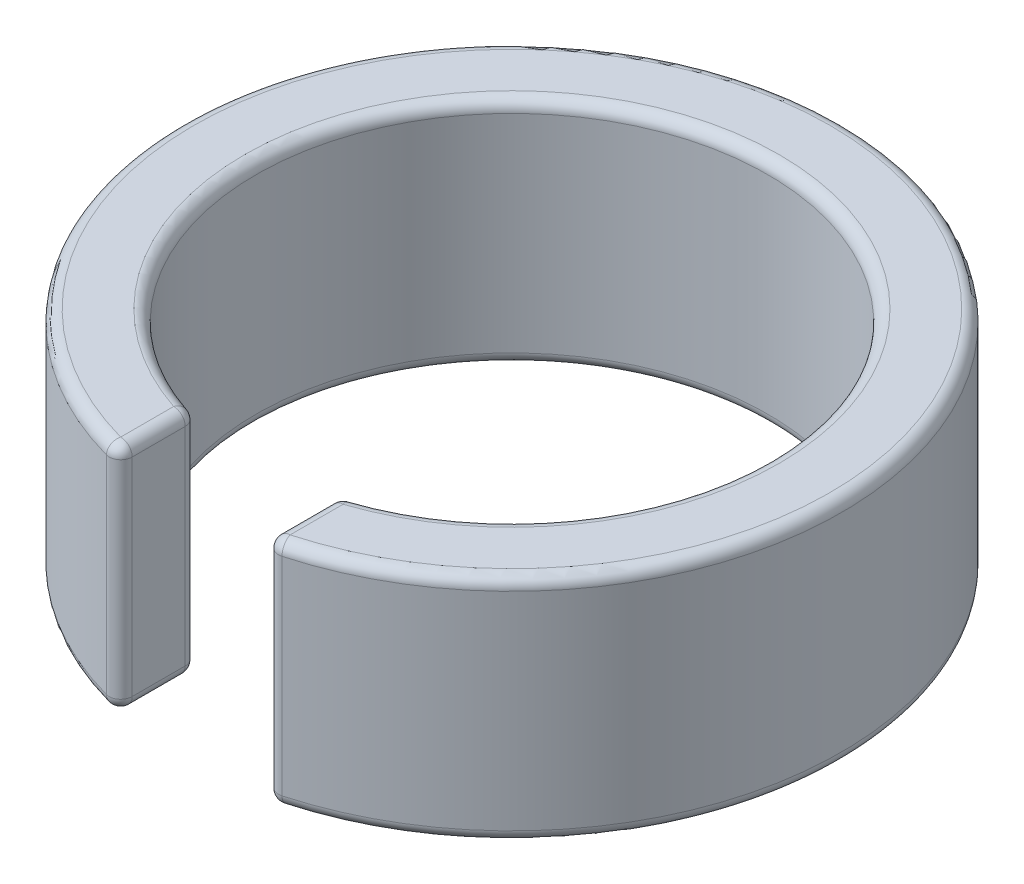
ISO-10303-21;
HEADER;
FILE_DESCRIPTION(('STEP AP214'),'2;1');
FILE_NAME('part.step','',(''),(''),'','','');
FILE_SCHEMA(('AUTOMOTIVE_DESIGN { 1 0 10303 214 1 1 1 1 }'));
ENDSEC;
DATA;
#1=APPLICATION_CONTEXT('core data for automotive mechanical design processes');
#2=APPLICATION_PROTOCOL_DEFINITION('international standard','automotive_design',2000,#1);
#3=PRODUCT_CONTEXT('',#1,'mechanical');
#4=PRODUCT('Part','Part','',(#3));
#5=PRODUCT_RELATED_PRODUCT_CATEGORY('part','',(#4));
#6=PRODUCT_DEFINITION_FORMATION('','',#4);
#7=PRODUCT_DEFINITION_CONTEXT('part definition',#1,'design');
#8=PRODUCT_DEFINITION('design','',#6,#7);
#9=PRODUCT_DEFINITION_SHAPE('','',#8);
#10=(LENGTH_UNIT() NAMED_UNIT(*) SI_UNIT(.MILLI.,.METRE.));
#11=(NAMED_UNIT(*) PLANE_ANGLE_UNIT() SI_UNIT($,.RADIAN.));
#12=(NAMED_UNIT(*) SI_UNIT($,.STERADIAN.) SOLID_ANGLE_UNIT());
#13=UNCERTAINTY_MEASURE_WITH_UNIT(LENGTH_MEASURE(1.E-05),#10,'distance_accuracy_value','');
#14=(GEOMETRIC_REPRESENTATION_CONTEXT(3) GLOBAL_UNCERTAINTY_ASSIGNED_CONTEXT((#13)) GLOBAL_UNIT_ASSIGNED_CONTEXT((#10,
#11,#12)) REPRESENTATION_CONTEXT('',''));
#15=CARTESIAN_POINT('',(0.,0.,0.));
#16=DIRECTION('',(0.,0.,1.));
#17=DIRECTION('',(1.,0.,0.));
#18=AXIS2_PLACEMENT_3D('',#15,#16,#17);
#19=CARTESIAN_POINT('',(0.,10.,0.));
#20=DIRECTION('',(0.,1.,0.));
#21=DIRECTION('',(0.,0.,1.));
#22=AXIS2_PLACEMENT_3D('',#19,#20,#21);
#23=PLANE('',#22);
#24=CARTESIAN_POINT('',(0.,10.,0.));
#25=DIRECTION('',(0.,1.,0.));
#26=DIRECTION('',(0.,0.,1.));
#27=AXIS2_PLACEMENT_3D('',#24,#25,#26);
#28=CIRCLE('',#27,11.6);
#29=CARTESIAN_POINT('',(-3.675,10.,11.0024713133005));
#30=VERTEX_POINT('',#29);
#31=CARTESIAN_POINT('',(3.675,10.,11.0024713133005));
#32=VERTEX_POINT('',#31);
#33=EDGE_CURVE('E48',#30,#32,#28,.F.);
#34=ORIENTED_EDGE('',*,*,#33,.T.);
#35=DIRECTION('',(0.,0.,-1.));
#36=VECTOR('',#35,1.);
#37=CARTESIAN_POINT('',(3.675,10.,0.));
#38=LINE('',#37,#36);
#39=CARTESIAN_POINT('',(3.675,10.,13.3016681284717));
#40=VERTEX_POINT('',#39);
#41=EDGE_CURVE('E11',#32,#40,#38,.F.);
#42=ORIENTED_EDGE('',*,*,#41,.T.);
#43=CARTESIAN_POINT('',(0.,10.,0.));
#44=DIRECTION('',(0.,1.,0.));
#45=DIRECTION('',(0.,0.,1.));
#46=AXIS2_PLACEMENT_3D('',#43,#44,#45);
#47=CIRCLE('',#46,13.8);
#48=CARTESIAN_POINT('',(-3.675,10.,13.3016681284717));
#49=VERTEX_POINT('',#48);
#50=EDGE_CURVE('E200',#40,#49,#47,.T.);
#51=ORIENTED_EDGE('',*,*,#50,.T.);
#52=DIRECTION('',(0.,0.,1.));
#53=VECTOR('',#52,1.);
#54=CARTESIAN_POINT('',(-3.675,10.,0.));
#55=LINE('',#54,#53);
#56=EDGE_CURVE('E59',#49,#30,#55,.F.);
#57=ORIENTED_EDGE('',*,*,#56,.T.);
#58=EDGE_LOOP('',(#34,#42,#51,#57));
#59=FACE_BOUND('',#58,.T.);
#60=ADVANCED_FACE('F39',(#59),#23,.T.);
#61=CARTESIAN_POINT('',(0.,0.,0.));
#62=DIRECTION('',(0.,1.,0.));
#63=DIRECTION('',(0.,0.,1.));
#64=AXIS2_PLACEMENT_3D('',#61,#62,#63);
#65=PLANE('',#64);
#66=DIRECTION('',(0.,0.,-1.));
#67=VECTOR('',#66,1.);
#68=CARTESIAN_POINT('',(3.675,0.,10.6362293600693));
#69=LINE('',#68,#67);
#70=CARTESIAN_POINT('',(3.675,0.,13.3016681284717));
#71=VERTEX_POINT('',#70);
#72=CARTESIAN_POINT('',(3.675,0.,11.0024713133005));
#73=VERTEX_POINT('',#72);
#74=EDGE_CURVE('E195',#71,#73,#69,.T.);
#75=ORIENTED_EDGE('',*,*,#74,.T.);
#76=CARTESIAN_POINT('',(0.,0.,0.));
#77=DIRECTION('',(0.,1.,0.));
#78=DIRECTION('',(0.,0.,1.));
#79=AXIS2_PLACEMENT_3D('',#76,#77,#78);
#80=CIRCLE('',#79,11.6);
#81=CARTESIAN_POINT('',(-3.675,0.,11.0024713133005));
#82=VERTEX_POINT('',#81);
#83=EDGE_CURVE('E197',#73,#82,#80,.T.);
#84=ORIENTED_EDGE('',*,*,#83,.T.);
#85=DIRECTION('',(0.,0.,1.));
#86=VECTOR('',#85,1.);
#87=CARTESIAN_POINT('',(-3.675,0.,13.9430762387645));
#88=LINE('',#87,#86);
#89=CARTESIAN_POINT('',(-3.675,0.,13.3016681284717));
#90=VERTEX_POINT('',#89);
#91=EDGE_CURVE('E191',#82,#90,#88,.T.);
#92=ORIENTED_EDGE('',*,*,#91,.T.);
#93=CARTESIAN_POINT('',(0.,0.,0.));
#94=DIRECTION('',(0.,1.,0.));
#95=DIRECTION('',(0.,0.,1.));
#96=AXIS2_PLACEMENT_3D('',#93,#94,#95);
#97=CIRCLE('',#96,13.8);
#98=EDGE_CURVE('E193',#90,#71,#97,.F.);
#99=ORIENTED_EDGE('',*,*,#98,.T.);
#100=EDGE_LOOP('',(#75,#84,#92,#99));
#101=FACE_BOUND('',#100,.T.);
#102=ADVANCED_FACE('F275',(#101),#65,.F.);
#103=CARTESIAN_POINT('',(0.,10.,0.));
#104=DIRECTION('',(0.,-1.,0.));
#105=DIRECTION('',(0.,0.,-1.));
#106=AXIS2_PLACEMENT_3D('',#103,#104,#105);
#107=CYLINDRICAL_SURFACE('',#106,14.3);
#108=DIRECTION('',(0.,-1.,0.));
#109=VECTOR('',#108,1.);
#110=CARTESIAN_POINT('',(3.80815217391304,10.,13.7836126258801));
#111=LINE('',#110,#109);
#112=CARTESIAN_POINT('',(3.80815217391304,9.5,13.7836126258801));
#113=VERTEX_POINT('',#112);
#114=CARTESIAN_POINT('',(3.80815217391304,0.5,13.7836126258801));
#115=VERTEX_POINT('',#114);
#116=EDGE_CURVE('E177',#113,#115,#111,.T.);
#117=ORIENTED_EDGE('',*,*,#116,.T.);
#118=CARTESIAN_POINT('',(0.,0.5,0.));
#119=DIRECTION('',(0.,1.,0.));
#120=DIRECTION('',(0.,0.,1.));
#121=AXIS2_PLACEMENT_3D('',#118,#119,#120);
#122=CIRCLE('',#121,14.3);
#123=CARTESIAN_POINT('',(-3.80815217391304,0.5,13.7836126258801));
#124=VERTEX_POINT('',#123);
#125=EDGE_CURVE('E180',#115,#124,#122,.T.);
#126=ORIENTED_EDGE('',*,*,#125,.T.);
#127=DIRECTION('',(0.,-1.,0.));
#128=VECTOR('',#127,1.);
#129=CARTESIAN_POINT('',(-3.80815217391304,10.,13.7836126258801));
#130=LINE('',#129,#128);
#131=CARTESIAN_POINT('',(-3.80815217391304,9.5,13.7836126258801));
#132=VERTEX_POINT('',#131);
#133=EDGE_CURVE('E175',#124,#132,#130,.F.);
#134=ORIENTED_EDGE('',*,*,#133,.T.);
#135=CARTESIAN_POINT('',(0.,9.5,0.));
#136=DIRECTION('',(0.,1.,0.));
#137=DIRECTION('',(0.,0.,1.));
#138=AXIS2_PLACEMENT_3D('',#135,#136,#137);
#139=CIRCLE('',#138,14.3);
#140=EDGE_CURVE('E173',#132,#113,#139,.F.);
#141=ORIENTED_EDGE('',*,*,#140,.T.);
#142=EDGE_LOOP('',(#117,#126,#134,#141));
#143=FACE_BOUND('',#142,.T.);
#144=ADVANCED_FACE('F302',(#143),#107,.T.);
#145=CARTESIAN_POINT('',(0.,10.,0.));
#146=DIRECTION('',(0.,-1.,0.));
#147=DIRECTION('',(0.,0.,-1.));
#148=AXIS2_PLACEMENT_3D('',#145,#146,#147);
#149=CYLINDRICAL_SURFACE('',#148,11.1);
#150=DIRECTION('',(0.,-1.,0.));
#151=VECTOR('',#150,1.);
#152=CARTESIAN_POINT('',(-3.51659482758621,10.,10.528226860141));
#153=LINE('',#152,#151);
#154=CARTESIAN_POINT('',(-3.51659482758621,9.5,10.528226860141));
#155=VERTEX_POINT('',#154);
#156=CARTESIAN_POINT('',(-3.51659482758621,0.5,10.528226860141));
#157=VERTEX_POINT('',#156);
#158=EDGE_CURVE('E156',#155,#157,#153,.T.);
#159=ORIENTED_EDGE('',*,*,#158,.T.);
#160=CARTESIAN_POINT('',(0.,0.5,0.));
#161=DIRECTION('',(0.,1.,0.));
#162=DIRECTION('',(0.,0.,1.));
#163=AXIS2_PLACEMENT_3D('',#160,#161,#162);
#164=CIRCLE('',#163,11.1);
#165=CARTESIAN_POINT('',(3.51659482758621,0.5,10.528226860141));
#166=VERTEX_POINT('',#165);
#167=EDGE_CURVE('E160',#157,#166,#164,.F.);
#168=ORIENTED_EDGE('',*,*,#167,.T.);
#169=DIRECTION('',(0.,-1.,0.));
#170=VECTOR('',#169,1.);
#171=CARTESIAN_POINT('',(3.51659482758621,10.,10.528226860141));
#172=LINE('',#171,#170);
#173=CARTESIAN_POINT('',(3.51659482758621,9.5,10.528226860141));
#174=VERTEX_POINT('',#173);
#175=EDGE_CURVE('E133',#166,#174,#172,.F.);
#176=ORIENTED_EDGE('',*,*,#175,.T.);
#177=CARTESIAN_POINT('',(0.,9.5,0.));
#178=DIRECTION('',(0.,1.,0.));
#179=DIRECTION('',(0.,0.,1.));
#180=AXIS2_PLACEMENT_3D('',#177,#178,#179);
#181=CIRCLE('',#180,11.1);
#182=EDGE_CURVE('E150',#174,#155,#181,.T.);
#183=ORIENTED_EDGE('',*,*,#182,.T.);
#184=EDGE_LOOP('',(#159,#168,#176,#183));
#185=FACE_BOUND('',#184,.T.);
#186=ADVANCED_FACE('F158',(#185),#149,.F.);
#187=CARTESIAN_POINT('',(3.175,10.,0.));
#188=DIRECTION('',(-1.,0.,0.));
#189=DIRECTION('',(0.,0.,1.));
#190=AXIS2_PLACEMENT_3D('',#187,#188,#189);
#191=PLANE('',#190);
#192=DIRECTION('',(0.,-1.,0.));
#193=VECTOR('',#192,1.);
#194=CARTESIAN_POINT('',(3.175,10.,11.0024713133005));
#195=LINE('',#194,#193);
#196=CARTESIAN_POINT('',(3.175,9.5,11.0024713133005));
#197=VERTEX_POINT('',#196);
#198=CARTESIAN_POINT('',(3.175,0.5,11.0024713133005));
#199=VERTEX_POINT('',#198);
#200=EDGE_CURVE('E135',#197,#199,#195,.T.);
#201=ORIENTED_EDGE('',*,*,#200,.T.);
#202=DIRECTION('',(0.,0.,-1.));
#203=VECTOR('',#202,1.);
#204=CARTESIAN_POINT('',(3.175,0.5,13.9430762387645));
#205=LINE('',#204,#203);
#206=CARTESIAN_POINT('',(3.175,0.5,13.3016681284717));
#207=VERTEX_POINT('',#206);
#208=EDGE_CURVE('E171',#199,#207,#205,.F.);
#209=ORIENTED_EDGE('',*,*,#208,.T.);
#210=DIRECTION('',(0.,1.,0.));
#211=VECTOR('',#210,1.);
#212=CARTESIAN_POINT('',(3.175,10.,13.3016681284717));
#213=LINE('',#212,#211);
#214=CARTESIAN_POINT('',(3.175,9.5,13.3016681284717));
#215=VERTEX_POINT('',#214);
#216=EDGE_CURVE('E168',#207,#215,#213,.T.);
#217=ORIENTED_EDGE('',*,*,#216,.T.);
#218=DIRECTION('',(0.,0.,-1.));
#219=VECTOR('',#218,1.);
#220=CARTESIAN_POINT('',(3.175,9.5,0.));
#221=LINE('',#220,#219);
#222=EDGE_CURVE('E163',#215,#197,#221,.T.);
#223=ORIENTED_EDGE('',*,*,#222,.T.);
#224=EDGE_LOOP('',(#201,#209,#217,#223));
#225=FACE_BOUND('',#224,.T.);
#226=ADVANCED_FACE('F365',(#225),#191,.T.);
#227=CARTESIAN_POINT('',(-3.175,10.,0.));
#228=DIRECTION('',(1.,0.,0.));
#229=DIRECTION('',(0.,0.,-1.));
#230=AXIS2_PLACEMENT_3D('',#227,#228,#229);
#231=PLANE('',#230);
#232=DIRECTION('',(0.,1.,0.));
#233=VECTOR('',#232,1.);
#234=CARTESIAN_POINT('',(-3.175,0.,13.3016681284717));
#235=LINE('',#234,#233);
#236=CARTESIAN_POINT('',(-3.175,9.5,13.3016681284717));
#237=VERTEX_POINT('',#236);
#238=CARTESIAN_POINT('',(-3.175,0.5,13.3016681284717));
#239=VERTEX_POINT('',#238);
#240=EDGE_CURVE('E184',#237,#239,#235,.F.);
#241=ORIENTED_EDGE('',*,*,#240,.T.);
#242=DIRECTION('',(0.,0.,1.));
#243=VECTOR('',#242,1.);
#244=CARTESIAN_POINT('',(-3.175,0.5,10.6362293600693));
#245=LINE('',#244,#243);
#246=CARTESIAN_POINT('',(-3.175,0.5,11.0024713133005));
#247=VERTEX_POINT('',#246);
#248=EDGE_CURVE('E189',#239,#247,#245,.F.);
#249=ORIENTED_EDGE('',*,*,#248,.T.);
#250=DIRECTION('',(0.,-1.,0.));
#251=VECTOR('',#250,1.);
#252=CARTESIAN_POINT('',(-3.175,10.,11.0024713133005));
#253=LINE('',#252,#251);
#254=CARTESIAN_POINT('',(-3.175,9.5,11.0024713133005));
#255=VERTEX_POINT('',#254);
#256=EDGE_CURVE('E186',#247,#255,#253,.F.);
#257=ORIENTED_EDGE('',*,*,#256,.T.);
#258=DIRECTION('',(0.,0.,1.));
#259=VECTOR('',#258,1.);
#260=CARTESIAN_POINT('',(-3.175,9.5,0.));
#261=LINE('',#260,#259);
#262=EDGE_CURVE('E182',#255,#237,#261,.T.);
#263=ORIENTED_EDGE('',*,*,#262,.T.);
#264=EDGE_LOOP('',(#241,#249,#257,#263));
#265=FACE_BOUND('',#264,.T.);
#266=ADVANCED_FACE('F284',(#265),#231,.T.);
#267=CARTESIAN_POINT('',(-3.675,10.,13.3016681284717));
#268=DIRECTION('',(0.,-1.,0.));
#269=DIRECTION('',(0.,0.,-1.));
#270=AXIS2_PLACEMENT_3D('',#267,#268,#269);
#271=CYLINDRICAL_SURFACE('',#270,0.5);
#272=CARTESIAN_POINT('',(-3.675,0.5,13.3016681284717));
#273=DIRECTION('',(0.,-1.,0.));
#274=DIRECTION('',(0.,0.,-1.));
#275=AXIS2_PLACEMENT_3D('',#272,#273,#274);
#276=CIRCLE('',#275,0.5);
#277=EDGE_CURVE('E43',#239,#124,#276,.T.);
#278=ORIENTED_EDGE('',*,*,#277,.F.);
#279=ORIENTED_EDGE('',*,*,#240,.F.);
#280=CARTESIAN_POINT('',(-3.675,9.5,13.3016681284717));
#281=DIRECTION('',(0.,1.,0.));
#282=DIRECTION('',(0.,0.,1.));
#283=AXIS2_PLACEMENT_3D('',#280,#281,#282);
#284=CIRCLE('',#283,0.5);
#285=EDGE_CURVE('E252',#132,#237,#284,.T.);
#286=ORIENTED_EDGE('',*,*,#285,.F.);
#287=ORIENTED_EDGE('',*,*,#133,.F.);
#288=EDGE_LOOP('',(#278,#279,#286,#287));
#289=FACE_BOUND('',#288,.T.);
#290=ADVANCED_FACE('F41',(#289),#271,.T.);
#291=CARTESIAN_POINT('',(-3.675,0.5,13.3016681284717));
#292=DIRECTION('',(0.,-1.,0.));
#293=DIRECTION('',(1.,0.,0.));
#294=AXIS2_PLACEMENT_3D('',#291,#292,#293);
#295=SPHERICAL_SURFACE('',#294,0.5);
#296=CARTESIAN_POINT('',(-3.675,0.5,13.3016681284717));
#297=DIRECTION('',(0.,0.,1.));
#298=DIRECTION('',(1.,0.,0.));
#299=AXIS2_PLACEMENT_3D('',#296,#297,#298);
#300=CIRCLE('',#299,0.5);
#301=EDGE_CURVE('E247',#239,#90,#300,.F.);
#302=ORIENTED_EDGE('',*,*,#301,.F.);
#303=ORIENTED_EDGE('',*,*,#277,.T.);
#304=CARTESIAN_POINT('',(-3.675,0.5,13.3016681284717));
#305=DIRECTION('',(0.96388899481679,0.,0.266304347826087));
#306=DIRECTION('',(0.266304347826087,0.,-0.96388899481679));
#307=AXIS2_PLACEMENT_3D('',#304,#305,#306);
#308=CIRCLE('',#307,0.5);
#309=EDGE_CURVE('E250',#90,#124,#308,.F.);
#310=ORIENTED_EDGE('',*,*,#309,.F.);
#311=EDGE_LOOP('',(#302,#303,#310));
#312=FACE_BOUND('',#311,.T.);
#313=ADVANCED_FACE('F263',(#312),#295,.T.);
#314=CARTESIAN_POINT('',(-3.675,9.5,13.3016681284717));
#315=DIRECTION('',(0.,1.,0.));
#316=DIRECTION('',(0.,0.,1.));
#317=AXIS2_PLACEMENT_3D('',#314,#315,#316);
#318=SPHERICAL_SURFACE('',#317,0.5);
#319=CARTESIAN_POINT('',(-3.675,9.5,13.3016681284717));
#320=DIRECTION('',(0.96388899481679,0.,0.266304347826088));
#321=DIRECTION('',(0.266304347826088,0.,-0.96388899481679));
#322=AXIS2_PLACEMENT_3D('',#319,#320,#321);
#323=CIRCLE('',#322,0.5);
#324=EDGE_CURVE('E241',#132,#49,#323,.F.);
#325=ORIENTED_EDGE('',*,*,#324,.F.);
#326=ORIENTED_EDGE('',*,*,#285,.T.);
#327=CARTESIAN_POINT('',(-3.675,9.5,13.3016681284717));
#328=DIRECTION('',(0.,0.,1.));
#329=DIRECTION('',(0.,-1.,0.));
#330=AXIS2_PLACEMENT_3D('',#327,#328,#329);
#331=CIRCLE('',#330,0.5);
#332=EDGE_CURVE('E244',#49,#237,#331,.F.);
#333=ORIENTED_EDGE('',*,*,#332,.F.);
#334=EDGE_LOOP('',(#325,#326,#333));
#335=FACE_BOUND('',#334,.T.);
#336=ADVANCED_FACE('F295',(#335),#318,.T.);
#337=CARTESIAN_POINT('',(0.,0.5,0.));
#338=DIRECTION('',(0.,1.,0.));
#339=DIRECTION('',(0.,0.,1.));
#340=AXIS2_PLACEMENT_3D('',#337,#338,#339);
#341=TOROIDAL_SURFACE('',#340,13.8,0.5);
#342=ORIENTED_EDGE('',*,*,#309,.T.);
#343=ORIENTED_EDGE('',*,*,#125,.F.);
#344=CARTESIAN_POINT('',(3.675,0.5,13.3016681284717));
#345=DIRECTION('',(-0.96388899481679,0.,0.266304347826088));
#346=DIRECTION('',(0.266304347826088,0.,0.96388899481679));
#347=AXIS2_PLACEMENT_3D('',#344,#345,#346);
#348=CIRCLE('',#347,0.5);
#349=EDGE_CURVE('E236',#71,#115,#348,.T.);
#350=ORIENTED_EDGE('',*,*,#349,.F.);
#351=ORIENTED_EDGE('',*,*,#98,.F.);
#352=EDGE_LOOP('',(#342,#343,#350,#351));
#353=FACE_BOUND('',#352,.T.);
#354=ADVANCED_FACE('F271',(#353),#341,.T.);
#355=CARTESIAN_POINT('',(-3.675,0.5,0.));
#356=DIRECTION('',(0.,0.,-1.));
#357=DIRECTION('',(-1.,0.,0.));
#358=AXIS2_PLACEMENT_3D('',#355,#356,#357);
#359=CYLINDRICAL_SURFACE('',#358,0.5);
#360=ORIENTED_EDGE('',*,*,#301,.T.);
#361=ORIENTED_EDGE('',*,*,#91,.F.);
#362=CARTESIAN_POINT('',(-3.675,0.5,11.0024713133005));
#363=DIRECTION('',(0.,0.,-1.));
#364=DIRECTION('',(0.,1.,0.));
#365=AXIS2_PLACEMENT_3D('',#362,#363,#364);
#366=CIRCLE('',#365,0.5);
#367=EDGE_CURVE('E233',#247,#82,#366,.T.);
#368=ORIENTED_EDGE('',*,*,#367,.F.);
#369=ORIENTED_EDGE('',*,*,#248,.F.);
#370=EDGE_LOOP('',(#360,#361,#368,#369));
#371=FACE_BOUND('',#370,.T.);
#372=ADVANCED_FACE('F281',(#371),#359,.T.);
#373=CARTESIAN_POINT('',(-3.675,10.,11.0024713133005));
#374=DIRECTION('',(0.,-1.,0.));
#375=DIRECTION('',(0.,0.,-1.));
#376=AXIS2_PLACEMENT_3D('',#373,#374,#375);
#377=CYLINDRICAL_SURFACE('',#376,0.5);
#378=CARTESIAN_POINT('',(-3.675,9.5,11.0024713133005));
#379=DIRECTION('',(0.,1.,0.));
#380=DIRECTION('',(0.,0.,1.));
#381=AXIS2_PLACEMENT_3D('',#378,#379,#380);
#382=CIRCLE('',#381,0.5);
#383=EDGE_CURVE('E227',#255,#155,#382,.T.);
#384=ORIENTED_EDGE('',*,*,#383,.F.);
#385=ORIENTED_EDGE('',*,*,#256,.F.);
#386=CARTESIAN_POINT('',(-3.675,0.5,11.0024713133005));
#387=DIRECTION('',(0.,-1.,0.));
#388=DIRECTION('',(1.,0.,0.));
#389=AXIS2_PLACEMENT_3D('',#386,#387,#388);
#390=CIRCLE('',#389,0.5);
#391=EDGE_CURVE('E230',#157,#247,#390,.T.);
#392=ORIENTED_EDGE('',*,*,#391,.F.);
#393=ORIENTED_EDGE('',*,*,#158,.F.);
#394=EDGE_LOOP('',(#384,#385,#392,#393));
#395=FACE_BOUND('',#394,.T.);
#396=ADVANCED_FACE('F288',(#395),#377,.T.);
#397=CARTESIAN_POINT('',(-3.675,9.5,0.));
#398=DIRECTION('',(0.,0.,1.));
#399=DIRECTION('',(1.,0.,0.));
#400=AXIS2_PLACEMENT_3D('',#397,#398,#399);
#401=CYLINDRICAL_SURFACE('',#400,0.5);
#402=ORIENTED_EDGE('',*,*,#332,.T.);
#403=ORIENTED_EDGE('',*,*,#262,.F.);
#404=CARTESIAN_POINT('',(-3.675,9.5,11.0024713133005));
#405=DIRECTION('',(0.,0.,-1.));
#406=DIRECTION('',(-1.,0.,0.));
#407=AXIS2_PLACEMENT_3D('',#404,#405,#406);
#408=CIRCLE('',#407,0.5);
#409=EDGE_CURVE('E225',#30,#255,#408,.T.);
#410=ORIENTED_EDGE('',*,*,#409,.F.);
#411=ORIENTED_EDGE('',*,*,#56,.F.);
#412=EDGE_LOOP('',(#402,#403,#410,#411));
#413=FACE_BOUND('',#412,.T.);
#414=ADVANCED_FACE('F293',(#413),#401,.T.);
#415=CARTESIAN_POINT('',(0.,9.5,0.));
#416=DIRECTION('',(0.,1.,0.));
#417=DIRECTION('',(0.,0.,1.));
#418=AXIS2_PLACEMENT_3D('',#415,#416,#417);
#419=TOROIDAL_SURFACE('',#418,13.8,0.5);
#420=ORIENTED_EDGE('',*,*,#324,.T.);
#421=ORIENTED_EDGE('',*,*,#50,.F.);
#422=CARTESIAN_POINT('',(3.675,9.5,13.3016681284717));
#423=DIRECTION('',(-0.96388899481679,0.,0.266304347826087));
#424=DIRECTION('',(0.266304347826087,0.,0.96388899481679));
#425=AXIS2_PLACEMENT_3D('',#422,#423,#424);
#426=CIRCLE('',#425,0.5);
#427=EDGE_CURVE('E222',#113,#40,#426,.T.);
#428=ORIENTED_EDGE('',*,*,#427,.F.);
#429=ORIENTED_EDGE('',*,*,#140,.F.);
#430=EDGE_LOOP('',(#420,#421,#428,#429));
#431=FACE_BOUND('',#430,.T.);
#432=ADVANCED_FACE('F299',(#431),#419,.T.);
#433=CARTESIAN_POINT('',(3.675,10.,13.3016681284717));
#434=DIRECTION('',(0.,-1.,0.));
#435=DIRECTION('',(0.,0.,-1.));
#436=AXIS2_PLACEMENT_3D('',#433,#434,#435);
#437=CYLINDRICAL_SURFACE('',#436,0.5);
#438=CARTESIAN_POINT('',(3.675,0.5,13.3016681284717));
#439=DIRECTION('',(0.,-1.,0.));
#440=DIRECTION('',(1.,0.,0.));
#441=AXIS2_PLACEMENT_3D('',#438,#439,#440);
#442=CIRCLE('',#441,0.5);
#443=EDGE_CURVE('E238',#115,#207,#442,.T.);
#444=ORIENTED_EDGE('',*,*,#443,.F.);
#445=ORIENTED_EDGE('',*,*,#116,.F.);
#446=CARTESIAN_POINT('',(3.675,9.5,13.3016681284717));
#447=DIRECTION('',(0.,1.,0.));
#448=DIRECTION('',(0.,0.,1.));
#449=AXIS2_PLACEMENT_3D('',#446,#447,#448);
#450=CIRCLE('',#449,0.5);
#451=EDGE_CURVE('E219',#215,#113,#450,.T.);
#452=ORIENTED_EDGE('',*,*,#451,.F.);
#453=ORIENTED_EDGE('',*,*,#216,.F.);
#454=EDGE_LOOP('',(#444,#445,#452,#453));
#455=FACE_BOUND('',#454,.T.);
#456=ADVANCED_FACE('F306',(#455),#437,.T.);
#457=CARTESIAN_POINT('',(3.675,0.5,13.3016681284717));
#458=DIRECTION('',(0.,-1.,0.));
#459=DIRECTION('',(0.,0.,-1.));
#460=AXIS2_PLACEMENT_3D('',#457,#458,#459);
#461=SPHERICAL_SURFACE('',#460,0.5);
#462=ORIENTED_EDGE('',*,*,#349,.T.);
#463=ORIENTED_EDGE('',*,*,#443,.T.);
#464=CARTESIAN_POINT('',(3.675,0.5,13.3016681284717));
#465=DIRECTION('',(0.,0.,1.));
#466=DIRECTION('',(0.,-1.,0.));
#467=AXIS2_PLACEMENT_3D('',#464,#465,#466);
#468=CIRCLE('',#467,0.5);
#469=EDGE_CURVE('E216',#71,#207,#468,.F.);
#470=ORIENTED_EDGE('',*,*,#469,.F.);
#471=EDGE_LOOP('',(#462,#463,#470));
#472=FACE_BOUND('',#471,.T.);
#473=ADVANCED_FACE('F310',(#472),#461,.T.);
#474=CARTESIAN_POINT('',(-3.675,0.5,11.0024713133005));
#475=DIRECTION('',(0.,-1.,0.));
#476=DIRECTION('',(0.,0.,-1.));
#477=AXIS2_PLACEMENT_3D('',#474,#475,#476);
#478=SPHERICAL_SURFACE('',#477,0.5);
#479=ORIENTED_EDGE('',*,*,#391,.T.);
#480=ORIENTED_EDGE('',*,*,#367,.T.);
#481=CARTESIAN_POINT('',(-3.675,0.5,11.0024713133005));
#482=DIRECTION('',(0.948488906319007,0.,0.316810344827585));
#483=DIRECTION('',(0.316810344827585,0.,-0.948488906319007));
#484=AXIS2_PLACEMENT_3D('',#481,#482,#483);
#485=CIRCLE('',#484,0.5);
#486=EDGE_CURVE('E214',#157,#82,#485,.F.);
#487=ORIENTED_EDGE('',*,*,#486,.F.);
#488=EDGE_LOOP('',(#479,#480,#487));
#489=FACE_BOUND('',#488,.T.);
#490=ADVANCED_FACE('F321',(#489),#478,.T.);
#491=CARTESIAN_POINT('',(-3.675,9.5,11.0024713133005));
#492=DIRECTION('',(0.,1.,0.));
#493=DIRECTION('',(0.,0.,1.));
#494=AXIS2_PLACEMENT_3D('',#491,#492,#493);
#495=SPHERICAL_SURFACE('',#494,0.5);
#496=ORIENTED_EDGE('',*,*,#409,.T.);
#497=ORIENTED_EDGE('',*,*,#383,.T.);
#498=CARTESIAN_POINT('',(-3.675,9.5,11.0024713133005));
#499=DIRECTION('',(0.948488906319007,0.,0.316810344827586));
#500=DIRECTION('',(0.316810344827586,0.,-0.948488906319007));
#501=AXIS2_PLACEMENT_3D('',#498,#499,#500);
#502=CIRCLE('',#501,0.5);
#503=EDGE_CURVE('E153',#30,#155,#502,.F.);
#504=ORIENTED_EDGE('',*,*,#503,.F.);
#505=EDGE_LOOP('',(#496,#497,#504));
#506=FACE_BOUND('',#505,.T.);
#507=ADVANCED_FACE('F323',(#506),#495,.T.);
#508=CARTESIAN_POINT('',(3.675,9.5,13.3016681284717));
#509=DIRECTION('',(0.,1.,0.));
#510=DIRECTION('',(0.,0.,1.));
#511=AXIS2_PLACEMENT_3D('',#508,#509,#510);
#512=SPHERICAL_SURFACE('',#511,0.5);
#513=ORIENTED_EDGE('',*,*,#451,.T.);
#514=ORIENTED_EDGE('',*,*,#427,.T.);
#515=CARTESIAN_POINT('',(3.675,9.5,13.3016681284717));
#516=DIRECTION('',(0.,0.,1.));
#517=DIRECTION('',(1.,0.,0.));
#518=AXIS2_PLACEMENT_3D('',#515,#516,#517);
#519=CIRCLE('',#518,0.5);
#520=EDGE_CURVE('E211',#215,#40,#519,.F.);
#521=ORIENTED_EDGE('',*,*,#520,.F.);
#522=EDGE_LOOP('',(#513,#514,#521));
#523=FACE_BOUND('',#522,.T.);
#524=ADVANCED_FACE('F329',(#523),#512,.T.);
#525=CARTESIAN_POINT('',(3.675,0.5,0.));
#526=DIRECTION('',(0.,0.,1.));
#527=DIRECTION('',(1.,0.,0.));
#528=AXIS2_PLACEMENT_3D('',#525,#526,#527);
#529=CYLINDRICAL_SURFACE('',#528,0.5);
#530=ORIENTED_EDGE('',*,*,#469,.T.);
#531=ORIENTED_EDGE('',*,*,#208,.F.);
#532=CARTESIAN_POINT('',(3.675,0.5,11.0024713133005));
#533=DIRECTION('',(0.,0.,-1.));
#534=DIRECTION('',(-1.,0.,0.));
#535=AXIS2_PLACEMENT_3D('',#532,#533,#534);
#536=CIRCLE('',#535,0.5);
#537=EDGE_CURVE('E208',#73,#199,#536,.T.);
#538=ORIENTED_EDGE('',*,*,#537,.F.);
#539=ORIENTED_EDGE('',*,*,#74,.F.);
#540=EDGE_LOOP('',(#530,#531,#538,#539));
#541=FACE_BOUND('',#540,.T.);
#542=ADVANCED_FACE('F313',(#541),#529,.T.);
#543=CARTESIAN_POINT('',(0.,0.5,0.));
#544=DIRECTION('',(0.,1.,0.));
#545=DIRECTION('',(0.,0.,1.));
#546=AXIS2_PLACEMENT_3D('',#543,#544,#545);
#547=TOROIDAL_SURFACE('',#546,11.6,0.5);
#548=ORIENTED_EDGE('',*,*,#486,.T.);
#549=ORIENTED_EDGE('',*,*,#83,.F.);
#550=CARTESIAN_POINT('',(3.675,0.5,11.0024713133005));
#551=DIRECTION('',(-0.948488906319007,0.,0.316810344827586));
#552=DIRECTION('',(0.316810344827586,0.,0.948488906319007));
#553=AXIS2_PLACEMENT_3D('',#550,#551,#552);
#554=CIRCLE('',#553,0.5);
#555=EDGE_CURVE('E147',#166,#73,#554,.T.);
#556=ORIENTED_EDGE('',*,*,#555,.F.);
#557=ORIENTED_EDGE('',*,*,#167,.F.);
#558=EDGE_LOOP('',(#548,#549,#556,#557));
#559=FACE_BOUND('',#558,.T.);
#560=ADVANCED_FACE('F319',(#559),#547,.T.);
#561=CARTESIAN_POINT('',(0.,9.5,0.));
#562=DIRECTION('',(0.,1.,0.));
#563=DIRECTION('',(0.,0.,1.));
#564=AXIS2_PLACEMENT_3D('',#561,#562,#563);
#565=TOROIDAL_SURFACE('',#564,11.6,0.5);
#566=ORIENTED_EDGE('',*,*,#503,.T.);
#567=ORIENTED_EDGE('',*,*,#182,.F.);
#568=CARTESIAN_POINT('',(3.675,9.5,11.0024713133005));
#569=DIRECTION('',(-0.948488906319007,0.,0.316810344827585));
#570=DIRECTION('',(0.316810344827585,0.,0.948488906319007));
#571=AXIS2_PLACEMENT_3D('',#568,#569,#570);
#572=CIRCLE('',#571,0.5);
#573=EDGE_CURVE('E141',#32,#174,#572,.T.);
#574=ORIENTED_EDGE('',*,*,#573,.F.);
#575=ORIENTED_EDGE('',*,*,#33,.F.);
#576=EDGE_LOOP('',(#566,#567,#574,#575));
#577=FACE_BOUND('',#576,.T.);
#578=ADVANCED_FACE('F151',(#577),#565,.T.);
#579=CARTESIAN_POINT('',(3.675,9.5,0.));
#580=DIRECTION('',(0.,0.,-1.));
#581=DIRECTION('',(-1.,0.,0.));
#582=AXIS2_PLACEMENT_3D('',#579,#580,#581);
#583=CYLINDRICAL_SURFACE('',#582,0.5);
#584=ORIENTED_EDGE('',*,*,#520,.T.);
#585=ORIENTED_EDGE('',*,*,#41,.F.);
#586=CARTESIAN_POINT('',(3.675,9.5,11.0024713133005));
#587=DIRECTION('',(0.,0.,-1.));
#588=DIRECTION('',(0.,1.,0.));
#589=AXIS2_PLACEMENT_3D('',#586,#587,#588);
#590=CIRCLE('',#589,0.5);
#591=EDGE_CURVE('E145',#197,#32,#590,.T.);
#592=ORIENTED_EDGE('',*,*,#591,.F.);
#593=ORIENTED_EDGE('',*,*,#222,.F.);
#594=EDGE_LOOP('',(#584,#585,#592,#593));
#595=FACE_BOUND('',#594,.T.);
#596=ADVANCED_FACE('F349',(#595),#583,.T.);
#597=CARTESIAN_POINT('',(3.675,0.5,11.0024713133005));
#598=DIRECTION('',(0.,-1.,0.));
#599=DIRECTION('',(0.,0.,-1.));
#600=AXIS2_PLACEMENT_3D('',#597,#598,#599);
#601=SPHERICAL_SURFACE('',#600,0.5);
#602=ORIENTED_EDGE('',*,*,#555,.T.);
#603=ORIENTED_EDGE('',*,*,#537,.T.);
#604=CARTESIAN_POINT('',(3.675,0.5,11.0024713133005));
#605=DIRECTION('',(0.,-1.,0.));
#606=DIRECTION('',(0.,0.,-1.));
#607=AXIS2_PLACEMENT_3D('',#604,#605,#606);
#608=CIRCLE('',#607,0.5);
#609=EDGE_CURVE('E138',#166,#199,#608,.F.);
#610=ORIENTED_EDGE('',*,*,#609,.F.);
#611=EDGE_LOOP('',(#602,#603,#610));
#612=FACE_BOUND('',#611,.T.);
#613=ADVANCED_FACE('F317',(#612),#601,.T.);
#614=CARTESIAN_POINT('',(3.675,9.5,11.0024713133005));
#615=DIRECTION('',(0.,1.,0.));
#616=DIRECTION('',(0.,0.,1.));
#617=AXIS2_PLACEMENT_3D('',#614,#615,#616);
#618=SPHERICAL_SURFACE('',#617,0.5);
#619=ORIENTED_EDGE('',*,*,#591,.T.);
#620=ORIENTED_EDGE('',*,*,#573,.T.);
#621=CARTESIAN_POINT('',(3.675,9.5,11.0024713133005));
#622=DIRECTION('',(0.,1.,0.));
#623=DIRECTION('',(0.,0.,1.));
#624=AXIS2_PLACEMENT_3D('',#621,#622,#623);
#625=CIRCLE('',#624,0.5);
#626=EDGE_CURVE('E129',#197,#174,#625,.F.);
#627=ORIENTED_EDGE('',*,*,#626,.F.);
#628=EDGE_LOOP('',(#619,#620,#627));
#629=FACE_BOUND('',#628,.T.);
#630=ADVANCED_FACE('F143',(#629),#618,.T.);
#631=CARTESIAN_POINT('',(3.675,10.,11.0024713133005));
#632=DIRECTION('',(0.,-1.,0.));
#633=DIRECTION('',(0.,0.,-1.));
#634=AXIS2_PLACEMENT_3D('',#631,#632,#633);
#635=CYLINDRICAL_SURFACE('',#634,0.5);
#636=ORIENTED_EDGE('',*,*,#609,.T.);
#637=ORIENTED_EDGE('',*,*,#200,.F.);
#638=ORIENTED_EDGE('',*,*,#626,.T.);
#639=ORIENTED_EDGE('',*,*,#175,.F.);
#640=EDGE_LOOP('',(#636,#637,#638,#639));
#641=FACE_BOUND('',#640,.T.);
#642=ADVANCED_FACE('F131',(#641),#635,.T.);
#643=CLOSED_SHELL('',(#60,#102,#144,#186,#226,#266,#290,#313,#336,#354,#372,#396,#414,#432,#456,
#473,#490,#507,#524,#542,#560,#578,#596,#613,#630,#642));
#644=MANIFOLD_SOLID_BREP('B2',#643);
#645=ADVANCED_BREP_SHAPE_REPRESENTATION('',(#18,#644),#14);
#646=SHAPE_DEFINITION_REPRESENTATION(#9,#645);
ENDSEC;
END-ISO-10303-21;
